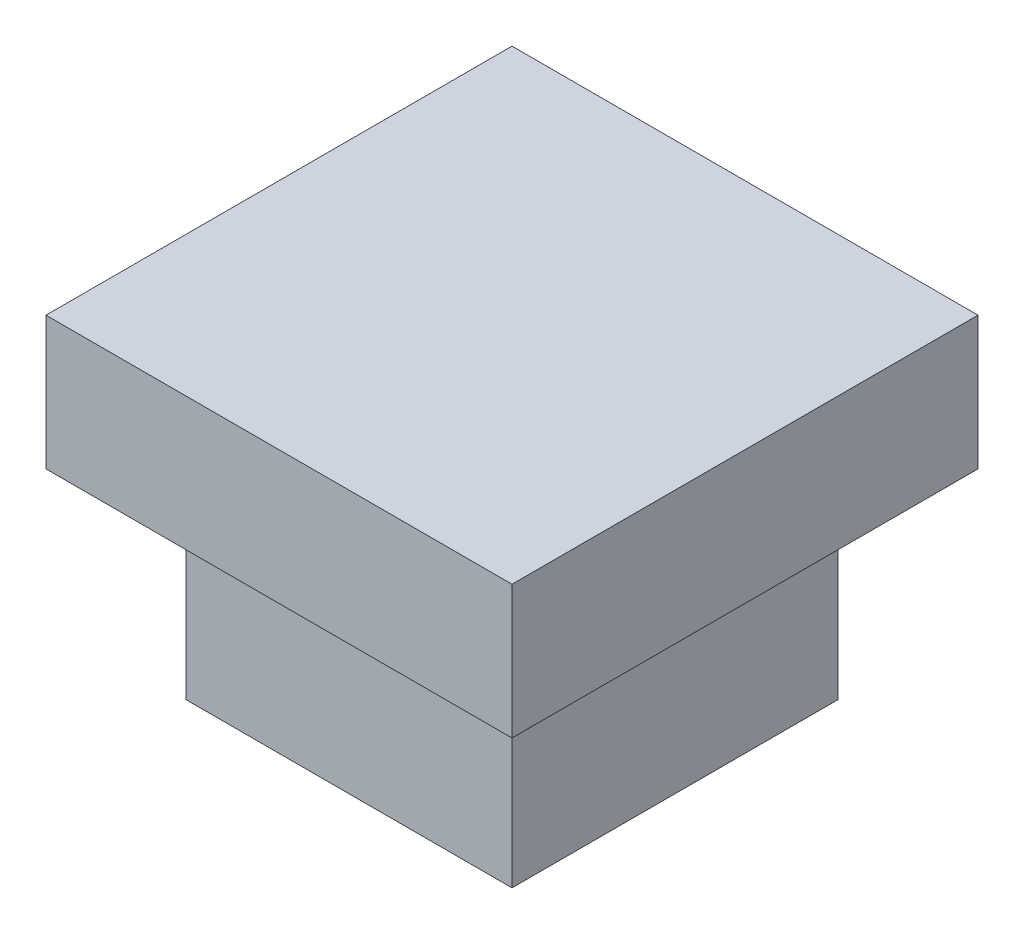
ISO-10303-21;
HEADER;
FILE_DESCRIPTION(('STEP AP214'),'2;1');
FILE_NAME('part.step','',(''),(''),'','','');
FILE_SCHEMA(('AUTOMOTIVE_DESIGN { 1 0 10303 214 1 1 1 1 }'));
ENDSEC;
DATA;
#1=APPLICATION_CONTEXT('core data for automotive mechanical design processes');
#2=APPLICATION_PROTOCOL_DEFINITION('international standard','automotive_design',2000,#1);
#3=PRODUCT_CONTEXT('',#1,'mechanical');
#4=PRODUCT('Part','Part','',(#3));
#5=PRODUCT_RELATED_PRODUCT_CATEGORY('part','',(#4));
#6=PRODUCT_DEFINITION_FORMATION('','',#4);
#7=PRODUCT_DEFINITION_CONTEXT('part definition',#1,'design');
#8=PRODUCT_DEFINITION('design','',#6,#7);
#9=PRODUCT_DEFINITION_SHAPE('','',#8);
#10=(LENGTH_UNIT() NAMED_UNIT(*) SI_UNIT(.MILLI.,.METRE.));
#11=(NAMED_UNIT(*) PLANE_ANGLE_UNIT() SI_UNIT($,.RADIAN.));
#12=(NAMED_UNIT(*) SI_UNIT($,.STERADIAN.) SOLID_ANGLE_UNIT());
#13=UNCERTAINTY_MEASURE_WITH_UNIT(LENGTH_MEASURE(1.E-05),#10,'distance_accuracy_value','');
#14=(GEOMETRIC_REPRESENTATION_CONTEXT(3) GLOBAL_UNCERTAINTY_ASSIGNED_CONTEXT((#13)) GLOBAL_UNIT_ASSIGNED_CONTEXT((#10,
#11,#12)) REPRESENTATION_CONTEXT('',''));
#15=CARTESIAN_POINT('',(0.,0.,0.));
#16=DIRECTION('',(0.,0.,1.));
#17=DIRECTION('',(1.,0.,0.));
#18=AXIS2_PLACEMENT_3D('',#15,#16,#17);
#19=CARTESIAN_POINT('',(2.45,3.,2.45));
#20=DIRECTION('',(-1.,0.,0.));
#21=DIRECTION('',(0.,0.,1.));
#22=AXIS2_PLACEMENT_3D('',#19,#20,#21);
#23=PLANE('',#22);
#24=DIRECTION('',(0.,0.,-1.));
#25=VECTOR('',#24,1.);
#26=CARTESIAN_POINT('',(2.45,0.,2.45));
#27=LINE('',#26,#25);
#28=CARTESIAN_POINT('',(2.45,0.,2.45));
#29=VERTEX_POINT('',#28);
#30=CARTESIAN_POINT('',(2.45,0.,-2.45));
#31=VERTEX_POINT('',#30);
#32=EDGE_CURVE('E131',#29,#31,#27,.T.);
#33=ORIENTED_EDGE('',*,*,#32,.T.);
#34=DIRECTION('',(0.,-1.,0.));
#35=VECTOR('',#34,1.);
#36=CARTESIAN_POINT('',(2.45,3.,-2.45));
#37=LINE('',#36,#35);
#38=CARTESIAN_POINT('',(2.45,3.,-2.45));
#39=VERTEX_POINT('',#38);
#40=EDGE_CURVE('E11',#39,#31,#37,.T.);
#41=ORIENTED_EDGE('',*,*,#40,.F.);
#42=DIRECTION('',(0.,0.,-1.));
#43=VECTOR('',#42,1.);
#44=CARTESIAN_POINT('',(2.45,3.,2.45));
#45=LINE('',#44,#43);
#46=CARTESIAN_POINT('',(2.45,3.,2.45));
#47=VERTEX_POINT('',#46);
#48=EDGE_CURVE('E140',#47,#39,#45,.T.);
#49=ORIENTED_EDGE('',*,*,#48,.F.);
#50=DIRECTION('',(0.,-1.,0.));
#51=VECTOR('',#50,1.);
#52=CARTESIAN_POINT('',(2.45,3.,2.45));
#53=LINE('',#52,#51);
#54=EDGE_CURVE('E149',#47,#29,#53,.T.);
#55=ORIENTED_EDGE('',*,*,#54,.T.);
#56=EDGE_LOOP('',(#33,#41,#49,#55));
#57=FACE_BOUND('',#56,.T.);
#58=ADVANCED_FACE('F33',(#57),#23,.F.);
#59=CARTESIAN_POINT('',(-2.45,3.,-2.45));
#60=DIRECTION('',(0.,0.,1.));
#61=DIRECTION('',(1.,0.,0.));
#62=AXIS2_PLACEMENT_3D('',#59,#60,#61);
#63=PLANE('',#62);
#64=DIRECTION('',(-1.,0.,0.));
#65=VECTOR('',#64,1.);
#66=CARTESIAN_POINT('',(-2.45,0.,-2.45));
#67=LINE('',#66,#65);
#68=CARTESIAN_POINT('',(-2.45,0.,-2.45));
#69=VERTEX_POINT('',#68);
#70=EDGE_CURVE('E134',#31,#69,#67,.T.);
#71=ORIENTED_EDGE('',*,*,#70,.T.);
#72=DIRECTION('',(0.,-1.,0.));
#73=VECTOR('',#72,1.);
#74=CARTESIAN_POINT('',(-2.45,3.,-2.45));
#75=LINE('',#74,#73);
#76=CARTESIAN_POINT('',(-2.45,3.,-2.45));
#77=VERTEX_POINT('',#76);
#78=EDGE_CURVE('E41',#77,#69,#75,.T.);
#79=ORIENTED_EDGE('',*,*,#78,.F.);
#80=DIRECTION('',(-1.,0.,0.));
#81=VECTOR('',#80,1.);
#82=CARTESIAN_POINT('',(-2.45,3.,-2.45));
#83=LINE('',#82,#81);
#84=EDGE_CURVE('E75',#39,#77,#83,.T.);
#85=ORIENTED_EDGE('',*,*,#84,.F.);
#86=ORIENTED_EDGE('',*,*,#40,.T.);
#87=EDGE_LOOP('',(#71,#79,#85,#86));
#88=FACE_BOUND('',#87,.T.);
#89=ADVANCED_FACE('F175',(#88),#63,.F.);
#90=CARTESIAN_POINT('',(-2.45,3.,2.45));
#91=DIRECTION('',(1.,0.,0.));
#92=DIRECTION('',(0.,0.,-1.));
#93=AXIS2_PLACEMENT_3D('',#90,#91,#92);
#94=PLANE('',#93);
#95=DIRECTION('',(0.,0.,1.));
#96=VECTOR('',#95,1.);
#97=CARTESIAN_POINT('',(-2.45,0.,2.45));
#98=LINE('',#97,#96);
#99=CARTESIAN_POINT('',(-2.45,0.,2.45));
#100=VERTEX_POINT('',#99);
#101=EDGE_CURVE('E65',#69,#100,#98,.T.);
#102=ORIENTED_EDGE('',*,*,#101,.T.);
#103=DIRECTION('',(0.,-1.,0.));
#104=VECTOR('',#103,1.);
#105=CARTESIAN_POINT('',(-2.45,3.,2.45));
#106=LINE('',#105,#104);
#107=CARTESIAN_POINT('',(-2.45,3.,2.45));
#108=VERTEX_POINT('',#107);
#109=EDGE_CURVE('E49',#108,#100,#106,.T.);
#110=ORIENTED_EDGE('',*,*,#109,.F.);
#111=DIRECTION('',(0.,0.,1.));
#112=VECTOR('',#111,1.);
#113=CARTESIAN_POINT('',(-2.45,3.,2.45));
#114=LINE('',#113,#112);
#115=EDGE_CURVE('E144',#77,#108,#114,.T.);
#116=ORIENTED_EDGE('',*,*,#115,.F.);
#117=ORIENTED_EDGE('',*,*,#78,.T.);
#118=EDGE_LOOP('',(#102,#110,#116,#117));
#119=FACE_BOUND('',#118,.T.);
#120=ADVANCED_FACE('F155',(#119),#94,.F.);
#121=CARTESIAN_POINT('',(-2.45,3.,2.45));
#122=DIRECTION('',(0.,0.,-1.));
#123=DIRECTION('',(-1.,0.,0.));
#124=AXIS2_PLACEMENT_3D('',#121,#122,#123);
#125=PLANE('',#124);
#126=DIRECTION('',(1.,0.,0.));
#127=VECTOR('',#126,1.);
#128=CARTESIAN_POINT('',(-2.45,0.,2.45));
#129=LINE('',#128,#127);
#130=EDGE_CURVE('E70',#100,#29,#129,.T.);
#131=ORIENTED_EDGE('',*,*,#130,.T.);
#132=ORIENTED_EDGE('',*,*,#54,.F.);
#133=DIRECTION('',(1.,0.,0.));
#134=VECTOR('',#133,1.);
#135=CARTESIAN_POINT('',(-2.45,3.,2.45));
#136=LINE('',#135,#134);
#137=EDGE_CURVE('E147',#108,#47,#136,.T.);
#138=ORIENTED_EDGE('',*,*,#137,.F.);
#139=ORIENTED_EDGE('',*,*,#109,.T.);
#140=EDGE_LOOP('',(#131,#132,#138,#139));
#141=FACE_BOUND('',#140,.T.);
#142=ADVANCED_FACE('F160',(#141),#125,.F.);
#143=CARTESIAN_POINT('',(0.,0.,0.));
#144=DIRECTION('',(0.,-1.,0.));
#145=DIRECTION('',(0.,0.,-1.));
#146=AXIS2_PLACEMENT_3D('',#143,#144,#145);
#147=PLANE('',#146);
#148=ORIENTED_EDGE('',*,*,#32,.F.);
#149=ORIENTED_EDGE('',*,*,#130,.F.);
#150=ORIENTED_EDGE('',*,*,#101,.F.);
#151=ORIENTED_EDGE('',*,*,#70,.F.);
#152=EDGE_LOOP('',(#148,#149,#150,#151));
#153=FACE_BOUND('',#152,.T.);
#154=ADVANCED_FACE('F158',(#153),#147,.T.);
#155=CARTESIAN_POINT('',(0.,3.,0.));
#156=DIRECTION('',(0.,1.,0.));
#157=DIRECTION('',(0.,0.,1.));
#158=AXIS2_PLACEMENT_3D('',#155,#156,#157);
#159=PLANE('',#158);
#160=DIRECTION('',(0.,0.,1.));
#161=VECTOR('',#160,1.);
#162=CARTESIAN_POINT('',(-3.5,3.,3.5));
#163=LINE('',#162,#161);
#164=CARTESIAN_POINT('',(-3.5,3.,-3.5));
#165=VERTEX_POINT('',#164);
#166=CARTESIAN_POINT('',(-3.5,3.,3.5));
#167=VERTEX_POINT('',#166);
#168=EDGE_CURVE('E130',#165,#167,#163,.T.);
#169=ORIENTED_EDGE('',*,*,#168,.F.);
#170=DIRECTION('',(-1.,0.,0.));
#171=VECTOR('',#170,1.);
#172=CARTESIAN_POINT('',(3.5,3.,-3.5));
#173=LINE('',#172,#171);
#174=CARTESIAN_POINT('',(3.5,3.,-3.5));
#175=VERTEX_POINT('',#174);
#176=EDGE_CURVE('E126',#175,#165,#173,.T.);
#177=ORIENTED_EDGE('',*,*,#176,.F.);
#178=DIRECTION('',(0.,0.,-1.));
#179=VECTOR('',#178,1.);
#180=CARTESIAN_POINT('',(3.5,3.,3.5));
#181=LINE('',#180,#179);
#182=CARTESIAN_POINT('',(3.5,3.,3.5));
#183=VERTEX_POINT('',#182);
#184=EDGE_CURVE('E202',#183,#175,#181,.T.);
#185=ORIENTED_EDGE('',*,*,#184,.F.);
#186=DIRECTION('',(1.,0.,0.));
#187=VECTOR('',#186,1.);
#188=CARTESIAN_POINT('',(3.5,3.,3.5));
#189=LINE('',#188,#187);
#190=EDGE_CURVE('E205',#167,#183,#189,.T.);
#191=ORIENTED_EDGE('',*,*,#190,.F.);
#192=EDGE_LOOP('',(#169,#177,#185,#191));
#193=FACE_BOUND('',#192,.T.);
#194=ORIENTED_EDGE('',*,*,#137,.T.);
#195=ORIENTED_EDGE('',*,*,#48,.T.);
#196=ORIENTED_EDGE('',*,*,#84,.T.);
#197=ORIENTED_EDGE('',*,*,#115,.T.);
#198=EDGE_LOOP('',(#194,#195,#196,#197));
#199=FACE_BOUND('',#198,.T.);
#200=ADVANCED_FACE('F162',(#193,#199),#159,.F.);
#201=CARTESIAN_POINT('',(-3.5,5.,3.5));
#202=DIRECTION('',(1.,0.,0.));
#203=DIRECTION('',(0.,0.,-1.));
#204=AXIS2_PLACEMENT_3D('',#201,#202,#203);
#205=PLANE('',#204);
#206=ORIENTED_EDGE('',*,*,#168,.T.);
#207=DIRECTION('',(0.,-1.,0.));
#208=VECTOR('',#207,1.);
#209=CARTESIAN_POINT('',(-3.5,5.,3.5));
#210=LINE('',#209,#208);
#211=CARTESIAN_POINT('',(-3.5,5.,3.5));
#212=VERTEX_POINT('',#211);
#213=EDGE_CURVE('E110',#212,#167,#210,.T.);
#214=ORIENTED_EDGE('',*,*,#213,.F.);
#215=DIRECTION('',(0.,0.,1.));
#216=VECTOR('',#215,1.);
#217=CARTESIAN_POINT('',(-3.5,5.,3.5));
#218=LINE('',#217,#216);
#219=CARTESIAN_POINT('',(-3.5,5.,-3.5));
#220=VERTEX_POINT('',#219);
#221=EDGE_CURVE('E117',#220,#212,#218,.T.);
#222=ORIENTED_EDGE('',*,*,#221,.F.);
#223=DIRECTION('',(0.,-1.,0.));
#224=VECTOR('',#223,1.);
#225=CARTESIAN_POINT('',(-3.5,5.,-3.5));
#226=LINE('',#225,#224);
#227=EDGE_CURVE('E199',#220,#165,#226,.T.);
#228=ORIENTED_EDGE('',*,*,#227,.T.);
#229=EDGE_LOOP('',(#206,#214,#222,#228));
#230=FACE_BOUND('',#229,.T.);
#231=ADVANCED_FACE('F128',(#230),#205,.F.);
#232=CARTESIAN_POINT('',(3.5,5.,3.5));
#233=DIRECTION('',(0.,0.,-1.));
#234=DIRECTION('',(-1.,0.,0.));
#235=AXIS2_PLACEMENT_3D('',#232,#233,#234);
#236=PLANE('',#235);
#237=ORIENTED_EDGE('',*,*,#190,.T.);
#238=DIRECTION('',(0.,-1.,0.));
#239=VECTOR('',#238,1.);
#240=CARTESIAN_POINT('',(3.5,5.,3.5));
#241=LINE('',#240,#239);
#242=CARTESIAN_POINT('',(3.5,5.,3.5));
#243=VERTEX_POINT('',#242);
#244=EDGE_CURVE('E113',#243,#183,#241,.T.);
#245=ORIENTED_EDGE('',*,*,#244,.F.);
#246=DIRECTION('',(1.,0.,0.));
#247=VECTOR('',#246,1.);
#248=CARTESIAN_POINT('',(3.5,5.,3.5));
#249=LINE('',#248,#247);
#250=EDGE_CURVE('E106',#212,#243,#249,.T.);
#251=ORIENTED_EDGE('',*,*,#250,.F.);
#252=ORIENTED_EDGE('',*,*,#213,.T.);
#253=EDGE_LOOP('',(#237,#245,#251,#252));
#254=FACE_BOUND('',#253,.T.);
#255=ADVANCED_FACE('F108',(#254),#236,.F.);
#256=CARTESIAN_POINT('',(3.5,5.,3.5));
#257=DIRECTION('',(-1.,0.,0.));
#258=DIRECTION('',(0.,0.,1.));
#259=AXIS2_PLACEMENT_3D('',#256,#257,#258);
#260=PLANE('',#259);
#261=ORIENTED_EDGE('',*,*,#184,.T.);
#262=DIRECTION('',(0.,-1.,0.));
#263=VECTOR('',#262,1.);
#264=CARTESIAN_POINT('',(3.5,5.,-3.5));
#265=LINE('',#264,#263);
#266=CARTESIAN_POINT('',(3.5,5.,-3.5));
#267=VERTEX_POINT('',#266);
#268=EDGE_CURVE('E136',#267,#175,#265,.T.);
#269=ORIENTED_EDGE('',*,*,#268,.F.);
#270=DIRECTION('',(0.,0.,-1.));
#271=VECTOR('',#270,1.);
#272=CARTESIAN_POINT('',(3.5,5.,3.5));
#273=LINE('',#272,#271);
#274=EDGE_CURVE('E116',#243,#267,#273,.T.);
#275=ORIENTED_EDGE('',*,*,#274,.F.);
#276=ORIENTED_EDGE('',*,*,#244,.T.);
#277=EDGE_LOOP('',(#261,#269,#275,#276));
#278=FACE_BOUND('',#277,.T.);
#279=ADVANCED_FACE('F188',(#278),#260,.F.);
#280=CARTESIAN_POINT('',(3.5,5.,-3.5));
#281=DIRECTION('',(0.,0.,1.));
#282=DIRECTION('',(1.,0.,0.));
#283=AXIS2_PLACEMENT_3D('',#280,#281,#282);
#284=PLANE('',#283);
#285=ORIENTED_EDGE('',*,*,#176,.T.);
#286=ORIENTED_EDGE('',*,*,#227,.F.);
#287=DIRECTION('',(-1.,0.,0.));
#288=VECTOR('',#287,1.);
#289=CARTESIAN_POINT('',(3.5,5.,-3.5));
#290=LINE('',#289,#288);
#291=EDGE_CURVE('E122',#267,#220,#290,.T.);
#292=ORIENTED_EDGE('',*,*,#291,.F.);
#293=ORIENTED_EDGE('',*,*,#268,.T.);
#294=EDGE_LOOP('',(#285,#286,#292,#293));
#295=FACE_BOUND('',#294,.T.);
#296=ADVANCED_FACE('F190',(#295),#284,.F.);
#297=CARTESIAN_POINT('',(0.,5.,0.));
#298=DIRECTION('',(0.,1.,0.));
#299=DIRECTION('',(0.,0.,1.));
#300=AXIS2_PLACEMENT_3D('',#297,#298,#299);
#301=PLANE('',#300);
#302=ORIENTED_EDGE('',*,*,#221,.T.);
#303=ORIENTED_EDGE('',*,*,#250,.T.);
#304=ORIENTED_EDGE('',*,*,#274,.T.);
#305=ORIENTED_EDGE('',*,*,#291,.T.);
#306=EDGE_LOOP('',(#302,#303,#304,#305));
#307=FACE_BOUND('',#306,.T.);
#308=ADVANCED_FACE('F120',(#307),#301,.T.);
#309=CLOSED_SHELL('',(#58,#89,#120,#142,#154,#200,#231,#255,#279,#296,#308));
#310=MANIFOLD_SOLID_BREP('B2',#309);
#311=ADVANCED_BREP_SHAPE_REPRESENTATION('',(#18,#310),#14);
#312=SHAPE_DEFINITION_REPRESENTATION(#9,#311);
ENDSEC;
END-ISO-10303-21;
